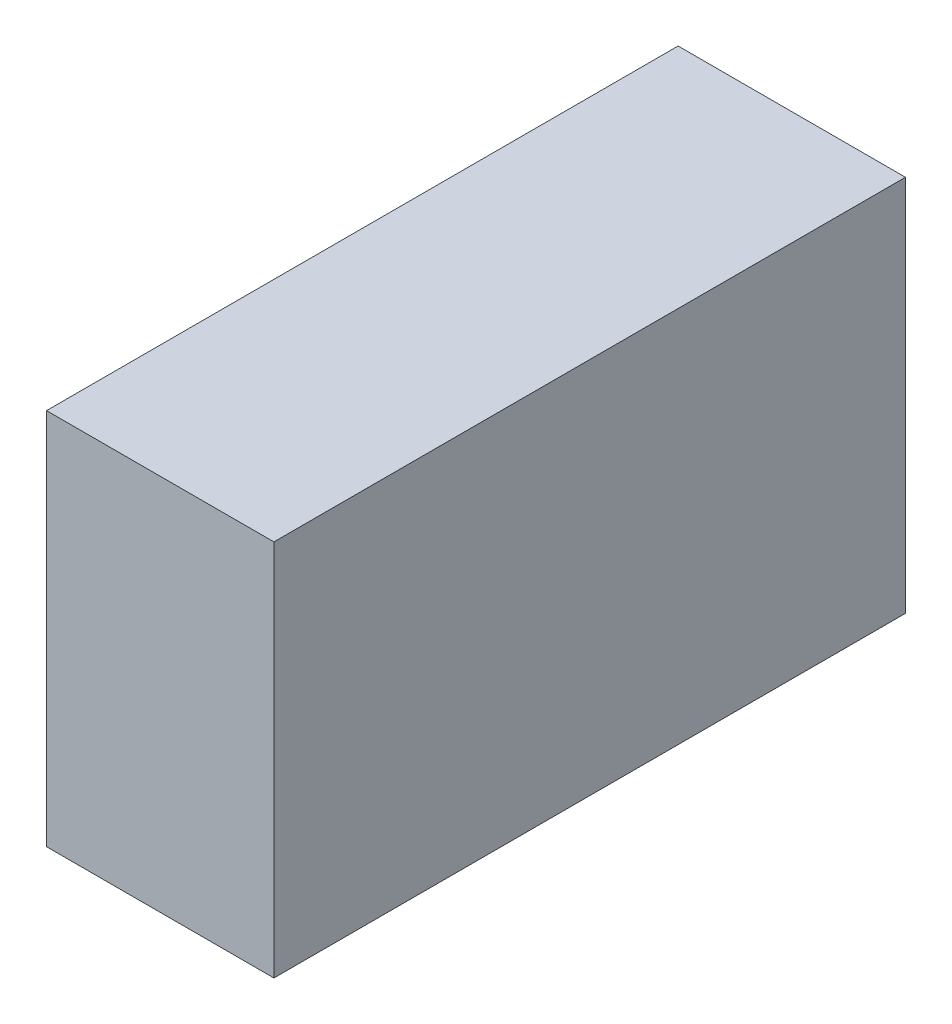
ISO-10303-21;
HEADER;
FILE_DESCRIPTION(('STEP AP214'),'2;1');
FILE_NAME('part.step','',(''),(''),'','','');
FILE_SCHEMA(('AUTOMOTIVE_DESIGN { 1 0 10303 214 1 1 1 1 }'));
ENDSEC;
DATA;
#1=APPLICATION_CONTEXT('core data for automotive mechanical design processes');
#2=APPLICATION_PROTOCOL_DEFINITION('international standard','automotive_design',2000,#1);
#3=PRODUCT_CONTEXT('',#1,'mechanical');
#4=PRODUCT('Part','Part','',(#3));
#5=PRODUCT_RELATED_PRODUCT_CATEGORY('part','',(#4));
#6=PRODUCT_DEFINITION_FORMATION('','',#4);
#7=PRODUCT_DEFINITION_CONTEXT('part definition',#1,'design');
#8=PRODUCT_DEFINITION('design','',#6,#7);
#9=PRODUCT_DEFINITION_SHAPE('','',#8);
#10=(LENGTH_UNIT() NAMED_UNIT(*) SI_UNIT(.MILLI.,.METRE.));
#11=(NAMED_UNIT(*) PLANE_ANGLE_UNIT() SI_UNIT($,.RADIAN.));
#12=(NAMED_UNIT(*) SI_UNIT($,.STERADIAN.) SOLID_ANGLE_UNIT());
#13=UNCERTAINTY_MEASURE_WITH_UNIT(LENGTH_MEASURE(1.E-05),#10,'distance_accuracy_value','');
#14=(GEOMETRIC_REPRESENTATION_CONTEXT(3) GLOBAL_UNCERTAINTY_ASSIGNED_CONTEXT((#13)) GLOBAL_UNIT_ASSIGNED_CONTEXT((#10,
#11,#12)) REPRESENTATION_CONTEXT('',''));
#15=CARTESIAN_POINT('',(0.,0.,0.));
#16=DIRECTION('',(0.,0.,1.));
#17=DIRECTION('',(1.,0.,0.));
#18=AXIS2_PLACEMENT_3D('',#15,#16,#17);
#19=CARTESIAN_POINT('',(-6.94915254237288,14.95053,-4.02542372881356));
#20=DIRECTION('',(1.,0.,0.));
#21=DIRECTION('',(0.,0.,-1.));
#22=AXIS2_PLACEMENT_3D('',#19,#20,#21);
#23=PLANE('',#22);
#24=DIRECTION('',(0.,0.,1.));
#25=VECTOR('',#24,1.);
#26=CARTESIAN_POINT('',(-6.94915254237288,0.,-4.02542372881356));
#27=LINE('',#26,#25);
#28=CARTESIAN_POINT('',(-6.94915254237288,0.,-4.02542372881356));
#29=VERTEX_POINT('',#28);
#30=CARTESIAN_POINT('',(-6.94915254237288,0.,20.9745762711864));
#31=VERTEX_POINT('',#30);
#32=EDGE_CURVE('E100',#29,#31,#27,.T.);
#33=ORIENTED_EDGE('',*,*,#32,.T.);
#34=DIRECTION('',(0.,-1.,0.));
#35=VECTOR('',#34,1.);
#36=CARTESIAN_POINT('',(-6.94915254237288,14.95053,20.9745762711864));
#37=LINE('',#36,#35);
#38=CARTESIAN_POINT('',(-6.94915254237288,14.95053,20.9745762711864));
#39=VERTEX_POINT('',#38);
#40=EDGE_CURVE('E11',#39,#31,#37,.T.);
#41=ORIENTED_EDGE('',*,*,#40,.F.);
#42=DIRECTION('',(0.,0.,1.));
#43=VECTOR('',#42,1.);
#44=CARTESIAN_POINT('',(-6.94915254237288,14.95053,-4.02542372881356));
#45=LINE('',#44,#43);
#46=CARTESIAN_POINT('',(-6.94915254237288,14.95053,-4.02542372881356));
#47=VERTEX_POINT('',#46);
#48=EDGE_CURVE('E88',#47,#39,#45,.T.);
#49=ORIENTED_EDGE('',*,*,#48,.F.);
#50=DIRECTION('',(0.,-1.,0.));
#51=VECTOR('',#50,1.);
#52=CARTESIAN_POINT('',(-6.94915254237288,14.95053,-4.02542372881356));
#53=LINE('',#52,#51);
#54=EDGE_CURVE('E96',#47,#29,#53,.T.);
#55=ORIENTED_EDGE('',*,*,#54,.T.);
#56=EDGE_LOOP('',(#33,#41,#49,#55));
#57=FACE_BOUND('',#56,.T.);
#58=ADVANCED_FACE('F37',(#57),#23,.F.);
#59=CARTESIAN_POINT('',(-6.94915254237288,14.95053,20.9745762711864));
#60=DIRECTION('',(0.,0.,-1.));
#61=DIRECTION('',(-1.,0.,0.));
#62=AXIS2_PLACEMENT_3D('',#59,#60,#61);
#63=PLANE('',#62);
#64=DIRECTION('',(1.,0.,0.));
#65=VECTOR('',#64,1.);
#66=CARTESIAN_POINT('',(-6.94915254237288,0.,20.9745762711864));
#67=LINE('',#66,#65);
#68=CARTESIAN_POINT('',(2.05084745762712,0.,20.9745762711864));
#69=VERTEX_POINT('',#68);
#70=EDGE_CURVE('E92',#31,#69,#67,.T.);
#71=ORIENTED_EDGE('',*,*,#70,.T.);
#72=DIRECTION('',(0.,-1.,0.));
#73=VECTOR('',#72,1.);
#74=CARTESIAN_POINT('',(2.05084745762712,14.95053,20.9745762711864));
#75=LINE('',#74,#73);
#76=CARTESIAN_POINT('',(2.05084745762712,14.95053,20.9745762711864));
#77=VERTEX_POINT('',#76);
#78=EDGE_CURVE('E45',#77,#69,#75,.T.);
#79=ORIENTED_EDGE('',*,*,#78,.F.);
#80=DIRECTION('',(1.,0.,0.));
#81=VECTOR('',#80,1.);
#82=CARTESIAN_POINT('',(-6.94915254237288,14.95053,20.9745762711864));
#83=LINE('',#82,#81);
#84=EDGE_CURVE('E83',#39,#77,#83,.T.);
#85=ORIENTED_EDGE('',*,*,#84,.F.);
#86=ORIENTED_EDGE('',*,*,#40,.T.);
#87=EDGE_LOOP('',(#71,#79,#85,#86));
#88=FACE_BOUND('',#87,.T.);
#89=ADVANCED_FACE('F91',(#88),#63,.F.);
#90=CARTESIAN_POINT('',(2.05084745762712,14.95053,-4.02542372881356));
#91=DIRECTION('',(-1.,0.,0.));
#92=DIRECTION('',(0.,0.,1.));
#93=AXIS2_PLACEMENT_3D('',#90,#91,#92);
#94=PLANE('',#93);
#95=DIRECTION('',(0.,0.,-1.));
#96=VECTOR('',#95,1.);
#97=CARTESIAN_POINT('',(2.05084745762712,0.,-4.02542372881356));
#98=LINE('',#97,#96);
#99=CARTESIAN_POINT('',(2.05084745762712,0.,-4.02542372881356));
#100=VERTEX_POINT('',#99);
#101=EDGE_CURVE('E70',#69,#100,#98,.T.);
#102=ORIENTED_EDGE('',*,*,#101,.T.);
#103=DIRECTION('',(0.,-1.,0.));
#104=VECTOR('',#103,1.);
#105=CARTESIAN_POINT('',(2.05084745762712,14.95053,-4.02542372881356));
#106=LINE('',#105,#104);
#107=CARTESIAN_POINT('',(2.05084745762712,14.95053,-4.02542372881356));
#108=VERTEX_POINT('',#107);
#109=EDGE_CURVE('E93',#108,#100,#106,.T.);
#110=ORIENTED_EDGE('',*,*,#109,.F.);
#111=DIRECTION('',(0.,0.,-1.));
#112=VECTOR('',#111,1.);
#113=CARTESIAN_POINT('',(2.05084745762712,14.95053,-4.02542372881356));
#114=LINE('',#113,#112);
#115=EDGE_CURVE('E86',#77,#108,#114,.T.);
#116=ORIENTED_EDGE('',*,*,#115,.F.);
#117=ORIENTED_EDGE('',*,*,#78,.T.);
#118=EDGE_LOOP('',(#102,#110,#116,#117));
#119=FACE_BOUND('',#118,.T.);
#120=ADVANCED_FACE('F94',(#119),#94,.F.);
#121=CARTESIAN_POINT('',(-6.94915254237288,14.95053,-4.02542372881356));
#122=DIRECTION('',(0.,0.,1.));
#123=DIRECTION('',(1.,0.,0.));
#124=AXIS2_PLACEMENT_3D('',#121,#122,#123);
#125=PLANE('',#124);
#126=DIRECTION('',(-1.,0.,0.));
#127=VECTOR('',#126,1.);
#128=CARTESIAN_POINT('',(-6.94915254237288,0.,-4.02542372881356));
#129=LINE('',#128,#127);
#130=EDGE_CURVE('E76',#100,#29,#129,.T.);
#131=ORIENTED_EDGE('',*,*,#130,.T.);
#132=ORIENTED_EDGE('',*,*,#54,.F.);
#133=DIRECTION('',(-1.,0.,0.));
#134=VECTOR('',#133,1.);
#135=CARTESIAN_POINT('',(-6.94915254237288,14.95053,-4.02542372881356));
#136=LINE('',#135,#134);
#137=EDGE_CURVE('E53',#108,#47,#136,.T.);
#138=ORIENTED_EDGE('',*,*,#137,.F.);
#139=ORIENTED_EDGE('',*,*,#109,.T.);
#140=EDGE_LOOP('',(#131,#132,#138,#139));
#141=FACE_BOUND('',#140,.T.);
#142=ADVANCED_FACE('F107',(#141),#125,.F.);
#143=CARTESIAN_POINT('',(0.,14.95053,0.));
#144=DIRECTION('',(0.,1.,0.));
#145=DIRECTION('',(0.,0.,1.));
#146=AXIS2_PLACEMENT_3D('',#143,#144,#145);
#147=PLANE('',#146);
#148=ORIENTED_EDGE('',*,*,#48,.T.);
#149=ORIENTED_EDGE('',*,*,#84,.T.);
#150=ORIENTED_EDGE('',*,*,#115,.T.);
#151=ORIENTED_EDGE('',*,*,#137,.T.);
#152=EDGE_LOOP('',(#148,#149,#150,#151));
#153=FACE_BOUND('',#152,.T.);
#154=ADVANCED_FACE('F84',(#153),#147,.T.);
#155=CARTESIAN_POINT('',(0.,0.,0.));
#156=DIRECTION('',(0.,1.,0.));
#157=DIRECTION('',(0.,0.,1.));
#158=AXIS2_PLACEMENT_3D('',#155,#156,#157);
#159=PLANE('',#158);
#160=ORIENTED_EDGE('',*,*,#32,.F.);
#161=ORIENTED_EDGE('',*,*,#130,.F.);
#162=ORIENTED_EDGE('',*,*,#101,.F.);
#163=ORIENTED_EDGE('',*,*,#70,.F.);
#164=EDGE_LOOP('',(#160,#161,#162,#163));
#165=FACE_BOUND('',#164,.T.);
#166=ADVANCED_FACE('F110',(#165),#159,.F.);
#167=CLOSED_SHELL('',(#58,#89,#120,#142,#154,#166));
#168=MANIFOLD_SOLID_BREP('B2',#167);
#169=ADVANCED_BREP_SHAPE_REPRESENTATION('',(#18,#168),#14);
#170=SHAPE_DEFINITION_REPRESENTATION(#9,#169);
ENDSEC;
END-ISO-10303-21;
